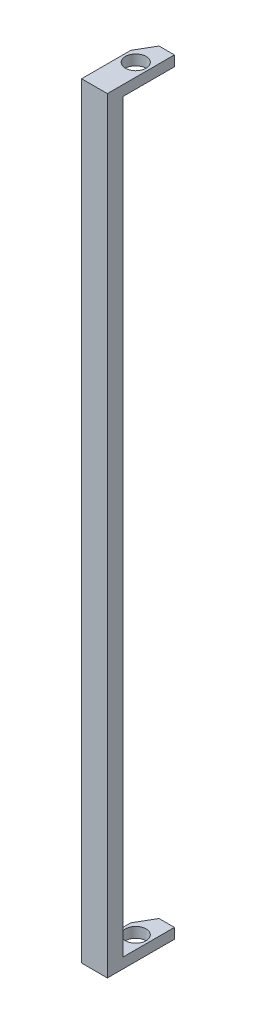
ISO-10303-21;
HEADER;
FILE_DESCRIPTION(('STEP AP214'),'2;1');
FILE_NAME('part.step','',(''),(''),'','','');
FILE_SCHEMA(('AUTOMOTIVE_DESIGN { 1 0 10303 214 1 1 1 1 }'));
ENDSEC;
DATA;
#1=APPLICATION_CONTEXT('core data for automotive mechanical design processes');
#2=APPLICATION_PROTOCOL_DEFINITION('international standard','automotive_design',2000,#1);
#3=PRODUCT_CONTEXT('',#1,'mechanical');
#4=PRODUCT('Part','Part','',(#3));
#5=PRODUCT_RELATED_PRODUCT_CATEGORY('part','',(#4));
#6=PRODUCT_DEFINITION_FORMATION('','',#4);
#7=PRODUCT_DEFINITION_CONTEXT('part definition',#1,'design');
#8=PRODUCT_DEFINITION('design','',#6,#7);
#9=PRODUCT_DEFINITION_SHAPE('','',#8);
#10=(LENGTH_UNIT() NAMED_UNIT(*) SI_UNIT(.MILLI.,.METRE.));
#11=(NAMED_UNIT(*) PLANE_ANGLE_UNIT() SI_UNIT($,.RADIAN.));
#12=(NAMED_UNIT(*) SI_UNIT($,.STERADIAN.) SOLID_ANGLE_UNIT());
#13=UNCERTAINTY_MEASURE_WITH_UNIT(LENGTH_MEASURE(1.E-05),#10,'distance_accuracy_value','');
#14=(GEOMETRIC_REPRESENTATION_CONTEXT(3) GLOBAL_UNCERTAINTY_ASSIGNED_CONTEXT((#13)) GLOBAL_UNIT_ASSIGNED_CONTEXT((#10,
#11,#12)) REPRESENTATION_CONTEXT('',''));
#15=CARTESIAN_POINT('',(0.,0.,0.));
#16=DIRECTION('',(0.,0.,1.));
#17=DIRECTION('',(1.,0.,0.));
#18=AXIS2_PLACEMENT_3D('',#15,#16,#17);
#19=CARTESIAN_POINT('',(0.,2.,0.));
#20=DIRECTION('',(0.,1.,0.));
#21=DIRECTION('',(0.,0.,1.));
#22=AXIS2_PLACEMENT_3D('',#19,#20,#21);
#23=PLANE('',#22);
#24=DIRECTION('',(-1.,0.,0.));
#25=VECTOR('',#24,1.);
#26=CARTESIAN_POINT('',(0.,2.,0.));
#27=LINE('',#26,#25);
#28=CARTESIAN_POINT('',(5.,2.,0.));
#29=VERTEX_POINT('',#28);
#30=CARTESIAN_POINT('',(0.,2.,0.));
#31=VERTEX_POINT('',#30);
#32=EDGE_CURVE('E50',#29,#31,#27,.T.);
#33=ORIENTED_EDGE('',*,*,#32,.F.);
#34=DIRECTION('',(0.,0.,-1.));
#35=VECTOR('',#34,1.);
#36=CARTESIAN_POINT('',(5.,2.,0.));
#37=LINE('',#36,#35);
#38=CARTESIAN_POINT('',(5.,2.,-10.));
#39=VERTEX_POINT('',#38);
#40=EDGE_CURVE('E84',#29,#39,#37,.T.);
#41=ORIENTED_EDGE('',*,*,#40,.T.);
#42=DIRECTION('',(-1.,0.,0.));
#43=VECTOR('',#42,1.);
#44=CARTESIAN_POINT('',(2.01,2.,-10.));
#45=LINE('',#44,#43);
#46=CARTESIAN_POINT('',(2.01,2.,-10.));
#47=VERTEX_POINT('',#46);
#48=EDGE_CURVE('E185',#39,#47,#45,.T.);
#49=ORIENTED_EDGE('',*,*,#48,.T.);
#50=DIRECTION('',(-0.500153222552384,0.,0.865936922628008));
#51=VECTOR('',#50,1.);
#52=CARTESIAN_POINT('',(2.01,2.,-10.));
#53=LINE('',#52,#51);
#54=CARTESIAN_POINT('',(0.,2.,-6.52));
#55=VERTEX_POINT('',#54);
#56=EDGE_CURVE('E187',#47,#55,#53,.T.);
#57=ORIENTED_EDGE('',*,*,#56,.T.);
#58=DIRECTION('',(0.,0.,1.));
#59=VECTOR('',#58,1.);
#60=CARTESIAN_POINT('',(0.,2.,0.));
#61=LINE('',#60,#59);
#62=EDGE_CURVE('E58',#55,#31,#61,.T.);
#63=ORIENTED_EDGE('',*,*,#62,.T.);
#64=EDGE_LOOP('',(#33,#41,#49,#57,#63));
#65=FACE_BOUND('',#64,.T.);
#66=CARTESIAN_POINT('',(2.5,2.,-5.));
#67=DIRECTION('',(0.,1.,0.));
#68=DIRECTION('',(0.,0.,1.));
#69=AXIS2_PLACEMENT_3D('',#66,#67,#68);
#70=CIRCLE('',#69,2.);
#71=CARTESIAN_POINT('',(2.5,2.,-3.));
#72=VERTEX_POINT('',#71);
#73=EDGE_CURVE('E177',#72,#72,#70,.T.);
#74=ORIENTED_EDGE('',*,*,#73,.F.);
#75=EDGE_LOOP('',(#74));
#76=FACE_BOUND('',#75,.T.);
#77=ADVANCED_FACE('F35',(#65,#76),#23,.T.);
#78=CARTESIAN_POINT('',(0.,0.,0.));
#79=DIRECTION('',(0.,1.,0.));
#80=DIRECTION('',(0.,0.,1.));
#81=AXIS2_PLACEMENT_3D('',#78,#79,#80);
#82=PLANE('',#81);
#83=DIRECTION('',(1.,0.,0.));
#84=VECTOR('',#83,1.);
#85=CARTESIAN_POINT('',(0.,0.,3.));
#86=LINE('',#85,#84);
#87=CARTESIAN_POINT('',(0.,0.,3.));
#88=VERTEX_POINT('',#87);
#89=CARTESIAN_POINT('',(5.,0.,3.));
#90=VERTEX_POINT('',#89);
#91=EDGE_CURVE('E180',#88,#90,#86,.T.);
#92=ORIENTED_EDGE('',*,*,#91,.F.);
#93=DIRECTION('',(0.,0.,1.));
#94=VECTOR('',#93,1.);
#95=CARTESIAN_POINT('',(0.,0.,0.));
#96=LINE('',#95,#94);
#97=CARTESIAN_POINT('',(0.,0.,-6.52));
#98=VERTEX_POINT('',#97);
#99=EDGE_CURVE('E124',#98,#88,#96,.T.);
#100=ORIENTED_EDGE('',*,*,#99,.F.);
#101=DIRECTION('',(-0.500153222552384,0.,0.865936922628008));
#102=VECTOR('',#101,1.);
#103=CARTESIAN_POINT('',(2.01,0.,-10.));
#104=LINE('',#103,#102);
#105=CARTESIAN_POINT('',(2.01,0.,-10.));
#106=VERTEX_POINT('',#105);
#107=EDGE_CURVE('E83',#106,#98,#104,.T.);
#108=ORIENTED_EDGE('',*,*,#107,.F.);
#109=DIRECTION('',(-1.,0.,0.));
#110=VECTOR('',#109,1.);
#111=CARTESIAN_POINT('',(2.01,0.,-10.));
#112=LINE('',#111,#110);
#113=CARTESIAN_POINT('',(5.,0.,-10.));
#114=VERTEX_POINT('',#113);
#115=EDGE_CURVE('E193',#114,#106,#112,.T.);
#116=ORIENTED_EDGE('',*,*,#115,.F.);
#117=DIRECTION('',(0.,0.,-1.));
#118=VECTOR('',#117,1.);
#119=CARTESIAN_POINT('',(5.,0.,0.));
#120=LINE('',#119,#118);
#121=EDGE_CURVE('E191',#90,#114,#120,.T.);
#122=ORIENTED_EDGE('',*,*,#121,.F.);
#123=EDGE_LOOP('',(#92,#100,#108,#116,#122));
#124=FACE_BOUND('',#123,.T.);
#125=CARTESIAN_POINT('',(2.5,0.,-5.));
#126=DIRECTION('',(0.,1.,0.));
#127=DIRECTION('',(0.,0.,1.));
#128=AXIS2_PLACEMENT_3D('',#125,#126,#127);
#129=CIRCLE('',#128,2.);
#130=CARTESIAN_POINT('',(2.5,0.,-3.));
#131=VERTEX_POINT('',#130);
#132=EDGE_CURVE('E176',#131,#131,#129,.T.);
#133=ORIENTED_EDGE('',*,*,#132,.T.);
#134=EDGE_LOOP('',(#133));
#135=FACE_BOUND('',#134,.T.);
#136=ADVANCED_FACE('F230',(#124,#135),#82,.F.);
#137=CARTESIAN_POINT('',(0.,2.,3.));
#138=DIRECTION('',(0.,0.,-1.));
#139=DIRECTION('',(-1.,0.,0.));
#140=AXIS2_PLACEMENT_3D('',#137,#138,#139);
#141=PLANE('',#140);
#142=ORIENTED_EDGE('',*,*,#91,.T.);
#143=DIRECTION('',(0.,-1.,0.));
#144=VECTOR('',#143,1.);
#145=CARTESIAN_POINT('',(5.,2.,3.));
#146=LINE('',#145,#144);
#147=CARTESIAN_POINT('',(5.,148.52,3.));
#148=VERTEX_POINT('',#147);
#149=EDGE_CURVE('E43',#148,#90,#146,.T.);
#150=ORIENTED_EDGE('',*,*,#149,.F.);
#151=DIRECTION('',(1.,0.,0.));
#152=VECTOR('',#151,1.);
#153=CARTESIAN_POINT('',(0.,148.52,3.));
#154=LINE('',#153,#152);
#155=CARTESIAN_POINT('',(0.,148.52,3.));
#156=VERTEX_POINT('',#155);
#157=EDGE_CURVE('E129',#156,#148,#154,.T.);
#158=ORIENTED_EDGE('',*,*,#157,.F.);
#159=DIRECTION('',(0.,-1.,0.));
#160=VECTOR('',#159,1.);
#161=CARTESIAN_POINT('',(0.,2.,3.));
#162=LINE('',#161,#160);
#163=EDGE_CURVE('E11',#156,#88,#162,.T.);
#164=ORIENTED_EDGE('',*,*,#163,.T.);
#165=EDGE_LOOP('',(#142,#150,#158,#164));
#166=FACE_BOUND('',#165,.T.);
#167=ADVANCED_FACE('F37',(#166),#141,.F.);
#168=CARTESIAN_POINT('',(5.,2.,0.));
#169=DIRECTION('',(-1.,0.,0.));
#170=DIRECTION('',(0.,0.,1.));
#171=AXIS2_PLACEMENT_3D('',#168,#169,#170);
#172=PLANE('',#171);
#173=ORIENTED_EDGE('',*,*,#121,.T.);
#174=DIRECTION('',(0.,-1.,0.));
#175=VECTOR('',#174,1.);
#176=CARTESIAN_POINT('',(5.,2.,-10.));
#177=LINE('',#176,#175);
#178=EDGE_CURVE('E200',#39,#114,#177,.T.);
#179=ORIENTED_EDGE('',*,*,#178,.F.);
#180=ORIENTED_EDGE('',*,*,#40,.F.);
#181=DIRECTION('',(0.,-1.,0.));
#182=VECTOR('',#181,1.);
#183=CARTESIAN_POINT('',(5.,146.52,0.));
#184=LINE('',#183,#182);
#185=CARTESIAN_POINT('',(5.,146.52,0.));
#186=VERTEX_POINT('',#185);
#187=EDGE_CURVE('E173',#186,#29,#184,.T.);
#188=ORIENTED_EDGE('',*,*,#187,.F.);
#189=DIRECTION('',(0.,0.,-1.));
#190=VECTOR('',#189,1.);
#191=CARTESIAN_POINT('',(5.,146.52,3.));
#192=LINE('',#191,#190);
#193=CARTESIAN_POINT('',(5.,146.52,-10.));
#194=VERTEX_POINT('',#193);
#195=EDGE_CURVE('E156',#186,#194,#192,.T.);
#196=ORIENTED_EDGE('',*,*,#195,.T.);
#197=DIRECTION('',(0.,-1.,0.));
#198=VECTOR('',#197,1.);
#199=CARTESIAN_POINT('',(5.,148.52,-10.));
#200=LINE('',#199,#198);
#201=CARTESIAN_POINT('',(5.,148.52,-10.));
#202=VERTEX_POINT('',#201);
#203=EDGE_CURVE('E164',#202,#194,#200,.T.);
#204=ORIENTED_EDGE('',*,*,#203,.F.);
#205=DIRECTION('',(0.,0.,-1.));
#206=VECTOR('',#205,1.);
#207=CARTESIAN_POINT('',(5.,148.52,3.));
#208=LINE('',#207,#206);
#209=EDGE_CURVE('E133',#148,#202,#208,.T.);
#210=ORIENTED_EDGE('',*,*,#209,.F.);
#211=ORIENTED_EDGE('',*,*,#149,.T.);
#212=EDGE_LOOP('',(#173,#179,#180,#188,#196,#204,#210,#211));
#213=FACE_BOUND('',#212,.T.);
#214=ADVANCED_FACE('F203',(#213),#172,.F.);
#215=CARTESIAN_POINT('',(2.01,2.,-10.));
#216=DIRECTION('',(0.,0.,1.));
#217=DIRECTION('',(1.,0.,0.));
#218=AXIS2_PLACEMENT_3D('',#215,#216,#217);
#219=PLANE('',#218);
#220=ORIENTED_EDGE('',*,*,#115,.T.);
#221=DIRECTION('',(0.,-1.,0.));
#222=VECTOR('',#221,1.);
#223=CARTESIAN_POINT('',(2.01,2.,-10.));
#224=LINE('',#223,#222);
#225=EDGE_CURVE('E198',#47,#106,#224,.T.);
#226=ORIENTED_EDGE('',*,*,#225,.F.);
#227=ORIENTED_EDGE('',*,*,#48,.F.);
#228=ORIENTED_EDGE('',*,*,#178,.T.);
#229=EDGE_LOOP('',(#220,#226,#227,#228));
#230=FACE_BOUND('',#229,.T.);
#231=ADVANCED_FACE('F225',(#230),#219,.F.);
#232=CARTESIAN_POINT('',(2.01,2.,-10.));
#233=DIRECTION('',(0.865936922628008,0.,0.500153222552384));
#234=DIRECTION('',(0.500153222552384,0.,-0.865936922628008));
#235=AXIS2_PLACEMENT_3D('',#232,#233,#234);
#236=PLANE('',#235);
#237=ORIENTED_EDGE('',*,*,#107,.T.);
#238=DIRECTION('',(0.,-1.,0.));
#239=VECTOR('',#238,1.);
#240=CARTESIAN_POINT('',(0.,2.,-6.52));
#241=LINE('',#240,#239);
#242=EDGE_CURVE('E189',#55,#98,#241,.T.);
#243=ORIENTED_EDGE('',*,*,#242,.F.);
#244=ORIENTED_EDGE('',*,*,#56,.F.);
#245=ORIENTED_EDGE('',*,*,#225,.T.);
#246=EDGE_LOOP('',(#237,#243,#244,#245));
#247=FACE_BOUND('',#246,.T.);
#248=ADVANCED_FACE('F228',(#247),#236,.F.);
#249=CARTESIAN_POINT('',(0.,2.,0.));
#250=DIRECTION('',(1.,0.,0.));
#251=DIRECTION('',(0.,0.,-1.));
#252=AXIS2_PLACEMENT_3D('',#249,#250,#251);
#253=PLANE('',#252);
#254=ORIENTED_EDGE('',*,*,#99,.T.);
#255=ORIENTED_EDGE('',*,*,#163,.F.);
#256=DIRECTION('',(0.,0.,1.));
#257=VECTOR('',#256,1.);
#258=CARTESIAN_POINT('',(0.,148.52,3.));
#259=LINE('',#258,#257);
#260=CARTESIAN_POINT('',(0.,148.52,-6.52));
#261=VERTEX_POINT('',#260);
#262=EDGE_CURVE('E122',#261,#156,#259,.T.);
#263=ORIENTED_EDGE('',*,*,#262,.F.);
#264=DIRECTION('',(0.,-1.,0.));
#265=VECTOR('',#264,1.);
#266=CARTESIAN_POINT('',(0.,148.52,-6.52));
#267=LINE('',#266,#265);
#268=CARTESIAN_POINT('',(0.,146.52,-6.52));
#269=VERTEX_POINT('',#268);
#270=EDGE_CURVE('E152',#261,#269,#267,.T.);
#271=ORIENTED_EDGE('',*,*,#270,.T.);
#272=DIRECTION('',(0.,0.,1.));
#273=VECTOR('',#272,1.);
#274=CARTESIAN_POINT('',(0.,146.52,3.));
#275=LINE('',#274,#273);
#276=CARTESIAN_POINT('',(0.,146.52,0.));
#277=VERTEX_POINT('',#276);
#278=EDGE_CURVE('E153',#269,#277,#275,.T.);
#279=ORIENTED_EDGE('',*,*,#278,.T.);
#280=DIRECTION('',(0.,-1.,0.));
#281=VECTOR('',#280,1.);
#282=CARTESIAN_POINT('',(0.,146.52,0.));
#283=LINE('',#282,#281);
#284=EDGE_CURVE('E170',#277,#31,#283,.T.);
#285=ORIENTED_EDGE('',*,*,#284,.T.);
#286=ORIENTED_EDGE('',*,*,#62,.F.);
#287=ORIENTED_EDGE('',*,*,#242,.T.);
#288=EDGE_LOOP('',(#254,#255,#263,#271,#279,#285,#286,#287));
#289=FACE_BOUND('',#288,.T.);
#290=ADVANCED_FACE('F119',(#289),#253,.F.);
#291=CARTESIAN_POINT('',(2.5,2.,-5.));
#292=DIRECTION('',(0.,-1.,0.));
#293=DIRECTION('',(0.,0.,-1.));
#294=AXIS2_PLACEMENT_3D('',#291,#292,#293);
#295=CYLINDRICAL_SURFACE('',#294,2.);
#296=ORIENTED_EDGE('',*,*,#73,.T.);
#297=EDGE_LOOP('',(#296));
#298=FACE_BOUND('',#297,.T.);
#299=ORIENTED_EDGE('',*,*,#132,.F.);
#300=EDGE_LOOP('',(#299));
#301=FACE_BOUND('',#300,.T.);
#302=ADVANCED_FACE('F236',(#298,#301),#295,.F.);
#303=CARTESIAN_POINT('',(0.,146.52,0.));
#304=DIRECTION('',(0.,0.,1.));
#305=DIRECTION('',(1.,0.,0.));
#306=AXIS2_PLACEMENT_3D('',#303,#304,#305);
#307=PLANE('',#306);
#308=ORIENTED_EDGE('',*,*,#32,.T.);
#309=ORIENTED_EDGE('',*,*,#284,.F.);
#310=DIRECTION('',(-1.,0.,0.));
#311=VECTOR('',#310,1.);
#312=CARTESIAN_POINT('',(0.,146.52,0.));
#313=LINE('',#312,#311);
#314=EDGE_CURVE('E167',#186,#277,#313,.T.);
#315=ORIENTED_EDGE('',*,*,#314,.F.);
#316=ORIENTED_EDGE('',*,*,#187,.T.);
#317=EDGE_LOOP('',(#308,#309,#315,#316));
#318=FACE_BOUND('',#317,.T.);
#319=ADVANCED_FACE('F220',(#318),#307,.F.);
#320=CARTESIAN_POINT('',(0.,148.52,0.));
#321=DIRECTION('',(0.,-1.,0.));
#322=DIRECTION('',(0.,0.,-1.));
#323=AXIS2_PLACEMENT_3D('',#320,#321,#322);
#324=PLANE('',#323);
#325=ORIENTED_EDGE('',*,*,#262,.T.);
#326=ORIENTED_EDGE('',*,*,#157,.T.);
#327=ORIENTED_EDGE('',*,*,#209,.T.);
#328=DIRECTION('',(-1.,0.,0.));
#329=VECTOR('',#328,1.);
#330=CARTESIAN_POINT('',(2.01,148.52,-10.));
#331=LINE('',#330,#329);
#332=CARTESIAN_POINT('',(2.01,148.52,-10.));
#333=VERTEX_POINT('',#332);
#334=EDGE_CURVE('E149',#202,#333,#331,.T.);
#335=ORIENTED_EDGE('',*,*,#334,.T.);
#336=DIRECTION('',(-0.500153222552384,0.,0.865936922628008));
#337=VECTOR('',#336,1.);
#338=CARTESIAN_POINT('',(2.01,148.52,-10.));
#339=LINE('',#338,#337);
#340=EDGE_CURVE('E138',#333,#261,#339,.T.);
#341=ORIENTED_EDGE('',*,*,#340,.T.);
#342=EDGE_LOOP('',(#325,#326,#327,#335,#341));
#343=FACE_BOUND('',#342,.T.);
#344=CARTESIAN_POINT('',(2.5,148.52,-5.));
#345=DIRECTION('',(0.,1.,0.));
#346=DIRECTION('',(0.,0.,1.));
#347=AXIS2_PLACEMENT_3D('',#344,#345,#346);
#348=CIRCLE('',#347,2.);
#349=CARTESIAN_POINT('',(2.5,148.52,-3.));
#350=VERTEX_POINT('',#349);
#351=EDGE_CURVE('E157',#350,#350,#348,.T.);
#352=ORIENTED_EDGE('',*,*,#351,.F.);
#353=EDGE_LOOP('',(#352));
#354=FACE_BOUND('',#353,.T.);
#355=ADVANCED_FACE('F135',(#343,#354),#324,.F.);
#356=CARTESIAN_POINT('',(0.,146.52,0.));
#357=DIRECTION('',(0.,-1.,0.));
#358=DIRECTION('',(0.,0.,-1.));
#359=AXIS2_PLACEMENT_3D('',#356,#357,#358);
#360=PLANE('',#359);
#361=ORIENTED_EDGE('',*,*,#195,.F.);
#362=ORIENTED_EDGE('',*,*,#314,.T.);
#363=ORIENTED_EDGE('',*,*,#278,.F.);
#364=DIRECTION('',(-0.500153222552384,0.,0.865936922628008));
#365=VECTOR('',#364,1.);
#366=CARTESIAN_POINT('',(2.01,146.52,-10.));
#367=LINE('',#366,#365);
#368=CARTESIAN_POINT('',(2.01,146.52,-10.));
#369=VERTEX_POINT('',#368);
#370=EDGE_CURVE('E140',#369,#269,#367,.T.);
#371=ORIENTED_EDGE('',*,*,#370,.F.);
#372=DIRECTION('',(-1.,0.,0.));
#373=VECTOR('',#372,1.);
#374=CARTESIAN_POINT('',(2.01,146.52,-10.));
#375=LINE('',#374,#373);
#376=EDGE_CURVE('E142',#194,#369,#375,.T.);
#377=ORIENTED_EDGE('',*,*,#376,.F.);
#378=EDGE_LOOP('',(#361,#362,#363,#371,#377));
#379=FACE_BOUND('',#378,.T.);
#380=CARTESIAN_POINT('',(2.5,146.52,-5.));
#381=DIRECTION('',(0.,1.,0.));
#382=DIRECTION('',(0.,0.,1.));
#383=AXIS2_PLACEMENT_3D('',#380,#381,#382);
#384=CIRCLE('',#383,2.);
#385=CARTESIAN_POINT('',(2.5,146.52,-3.));
#386=VERTEX_POINT('',#385);
#387=EDGE_CURVE('E145',#386,#386,#384,.T.);
#388=ORIENTED_EDGE('',*,*,#387,.T.);
#389=EDGE_LOOP('',(#388));
#390=FACE_BOUND('',#389,.T.);
#391=ADVANCED_FACE('F216',(#379,#390),#360,.T.);
#392=CARTESIAN_POINT('',(2.01,148.52,-10.));
#393=DIRECTION('',(0.,0.,1.));
#394=DIRECTION('',(1.,0.,0.));
#395=AXIS2_PLACEMENT_3D('',#392,#393,#394);
#396=PLANE('',#395);
#397=ORIENTED_EDGE('',*,*,#376,.T.);
#398=DIRECTION('',(0.,-1.,0.));
#399=VECTOR('',#398,1.);
#400=CARTESIAN_POINT('',(2.01,148.52,-10.));
#401=LINE('',#400,#399);
#402=EDGE_CURVE('E161',#333,#369,#401,.T.);
#403=ORIENTED_EDGE('',*,*,#402,.F.);
#404=ORIENTED_EDGE('',*,*,#334,.F.);
#405=ORIENTED_EDGE('',*,*,#203,.T.);
#406=EDGE_LOOP('',(#397,#403,#404,#405));
#407=FACE_BOUND('',#406,.T.);
#408=ADVANCED_FACE('F208',(#407),#396,.F.);
#409=CARTESIAN_POINT('',(2.01,148.52,-10.));
#410=DIRECTION('',(0.865936922628008,0.,0.500153222552384));
#411=DIRECTION('',(0.500153222552384,0.,-0.865936922628008));
#412=AXIS2_PLACEMENT_3D('',#409,#410,#411);
#413=PLANE('',#412);
#414=ORIENTED_EDGE('',*,*,#370,.T.);
#415=ORIENTED_EDGE('',*,*,#270,.F.);
#416=ORIENTED_EDGE('',*,*,#340,.F.);
#417=ORIENTED_EDGE('',*,*,#402,.T.);
#418=EDGE_LOOP('',(#414,#415,#416,#417));
#419=FACE_BOUND('',#418,.T.);
#420=ADVANCED_FACE('F212',(#419),#413,.F.);
#421=CARTESIAN_POINT('',(2.5,148.52,-5.));
#422=DIRECTION('',(0.,-1.,0.));
#423=DIRECTION('',(0.,0.,-1.));
#424=AXIS2_PLACEMENT_3D('',#421,#422,#423);
#425=CYLINDRICAL_SURFACE('',#424,2.);
#426=ORIENTED_EDGE('',*,*,#351,.T.);
#427=EDGE_LOOP('',(#426));
#428=FACE_BOUND('',#427,.T.);
#429=ORIENTED_EDGE('',*,*,#387,.F.);
#430=EDGE_LOOP('',(#429));
#431=FACE_BOUND('',#430,.T.);
#432=ADVANCED_FACE('F353',(#428,#431),#425,.F.);
#433=CLOSED_SHELL('',(#77,#136,#167,#214,#231,#248,#290,#302,#319,#355,#391,#408,#420,#432));
#434=MANIFOLD_SOLID_BREP('B2',#433);
#435=ADVANCED_BREP_SHAPE_REPRESENTATION('',(#18,#434),#14);
#436=SHAPE_DEFINITION_REPRESENTATION(#9,#435);
ENDSEC;
END-ISO-10303-21;
